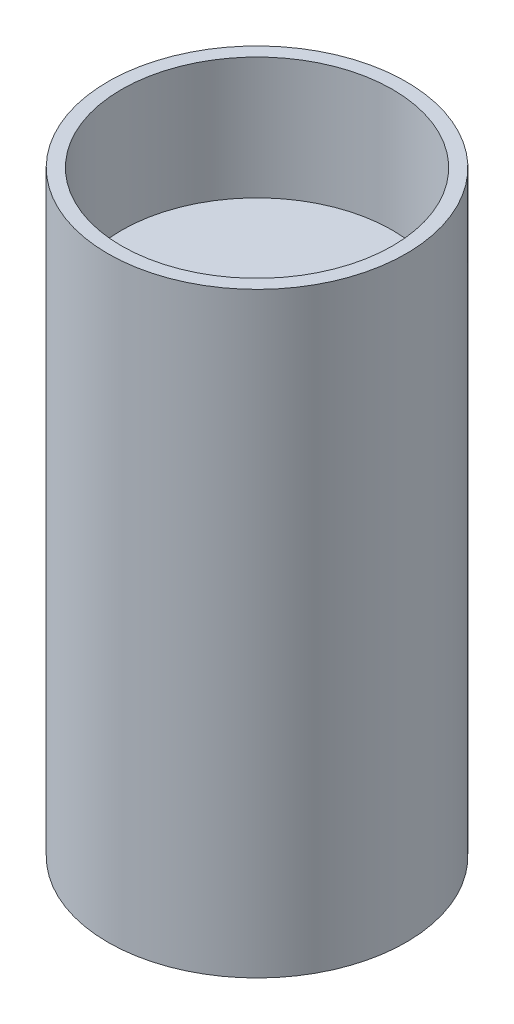
ISO-10303-21;
HEADER;
FILE_DESCRIPTION(('STEP AP214'),'2;1');
FILE_NAME('part.step','',(''),(''),'','','');
FILE_SCHEMA(('AUTOMOTIVE_DESIGN { 1 0 10303 214 1 1 1 1 }'));
ENDSEC;
DATA;
#1=APPLICATION_CONTEXT('core data for automotive mechanical design processes');
#2=APPLICATION_PROTOCOL_DEFINITION('international standard','automotive_design',2000,#1);
#3=PRODUCT_CONTEXT('',#1,'mechanical');
#4=PRODUCT('Part','Part','',(#3));
#5=PRODUCT_RELATED_PRODUCT_CATEGORY('part','',(#4));
#6=PRODUCT_DEFINITION_FORMATION('','',#4);
#7=PRODUCT_DEFINITION_CONTEXT('part definition',#1,'design');
#8=PRODUCT_DEFINITION('design','',#6,#7);
#9=PRODUCT_DEFINITION_SHAPE('','',#8);
#10=(LENGTH_UNIT() NAMED_UNIT(*) SI_UNIT(.MILLI.,.METRE.));
#11=(NAMED_UNIT(*) PLANE_ANGLE_UNIT() SI_UNIT($,.RADIAN.));
#12=(NAMED_UNIT(*) SI_UNIT($,.STERADIAN.) SOLID_ANGLE_UNIT());
#13=UNCERTAINTY_MEASURE_WITH_UNIT(LENGTH_MEASURE(1.E-05),#10,'distance_accuracy_value','');
#14=(GEOMETRIC_REPRESENTATION_CONTEXT(3) GLOBAL_UNCERTAINTY_ASSIGNED_CONTEXT((#13)) GLOBAL_UNIT_ASSIGNED_CONTEXT((#10,
#11,#12)) REPRESENTATION_CONTEXT('',''));
#15=CARTESIAN_POINT('',(0.,0.,0.));
#16=DIRECTION('',(0.,0.,1.));
#17=DIRECTION('',(1.,0.,0.));
#18=AXIS2_PLACEMENT_3D('',#15,#16,#17);
#19=CARTESIAN_POINT('',(0.,220.,0.));
#20=DIRECTION('',(0.,-1.,0.));
#21=DIRECTION('',(0.,0.,-1.));
#22=AXIS2_PLACEMENT_3D('',#19,#20,#21);
#23=CYLINDRICAL_SURFACE('',#22,55.);
#24=CARTESIAN_POINT('',(0.,220.,0.));
#25=DIRECTION('',(0.,1.,0.));
#26=DIRECTION('',(0.,0.,1.));
#27=AXIS2_PLACEMENT_3D('',#24,#25,#26);
#28=CIRCLE('',#27,55.);
#29=CARTESIAN_POINT('',(0.,220.,55.));
#30=VERTEX_POINT('',#29);
#31=EDGE_CURVE('E10',#30,#30,#28,.T.);
#32=ORIENTED_EDGE('',*,*,#31,.F.);
#33=EDGE_LOOP('',(#32));
#34=FACE_BOUND('',#33,.T.);
#35=CARTESIAN_POINT('',(0.,0.,0.));
#36=DIRECTION('',(0.,1.,0.));
#37=DIRECTION('',(0.,0.,1.));
#38=AXIS2_PLACEMENT_3D('',#35,#36,#37);
#39=CIRCLE('',#38,55.);
#40=CARTESIAN_POINT('',(0.,0.,55.));
#41=VERTEX_POINT('',#40);
#42=EDGE_CURVE('E40',#41,#41,#39,.T.);
#43=ORIENTED_EDGE('',*,*,#42,.T.);
#44=EDGE_LOOP('',(#43));
#45=FACE_BOUND('',#44,.T.);
#46=ADVANCED_FACE('F37',(#34,#45),#23,.T.);
#47=CARTESIAN_POINT('',(0.,220.,0.));
#48=DIRECTION('',(0.,1.,0.));
#49=DIRECTION('',(0.,0.,1.));
#50=AXIS2_PLACEMENT_3D('',#47,#48,#49);
#51=PLANE('',#50);
#52=CARTESIAN_POINT('',(0.,220.,0.));
#53=DIRECTION('',(0.,1.,0.));
#54=DIRECTION('',(0.,0.,1.));
#55=AXIS2_PLACEMENT_3D('',#52,#53,#54);
#56=CIRCLE('',#55,50.);
#57=CARTESIAN_POINT('',(0.,220.,50.));
#58=VERTEX_POINT('',#57);
#59=EDGE_CURVE('E59',#58,#58,#56,.T.);
#60=ORIENTED_EDGE('',*,*,#59,.F.);
#61=EDGE_LOOP('',(#60));
#62=FACE_BOUND('',#61,.T.);
#63=ORIENTED_EDGE('',*,*,#31,.T.);
#64=EDGE_LOOP('',(#63));
#65=FACE_BOUND('',#64,.T.);
#66=ADVANCED_FACE('F76',(#62,#65),#51,.T.);
#67=CARTESIAN_POINT('',(0.,0.,0.));
#68=DIRECTION('',(0.,1.,0.));
#69=DIRECTION('',(0.,0.,1.));
#70=AXIS2_PLACEMENT_3D('',#67,#68,#69);
#71=PLANE('',#70);
#72=CARTESIAN_POINT('',(0.,0.,0.));
#73=DIRECTION('',(0.,-1.,0.));
#74=DIRECTION('',(0.,0.,-1.));
#75=AXIS2_PLACEMENT_3D('',#72,#73,#74);
#76=CIRCLE('',#75,46.9865799165357);
#77=CARTESIAN_POINT('',(0.,0.,-46.9865799165357));
#78=VERTEX_POINT('',#77);
#79=EDGE_CURVE('E51',#78,#78,#76,.T.);
#80=ORIENTED_EDGE('',*,*,#79,.F.);
#81=EDGE_LOOP('',(#80));
#82=FACE_BOUND('',#81,.T.);
#83=ORIENTED_EDGE('',*,*,#42,.F.);
#84=EDGE_LOOP('',(#83));
#85=FACE_BOUND('',#84,.T.);
#86=ADVANCED_FACE('F78',(#82,#85),#71,.F.);
#87=CARTESIAN_POINT('',(0.,150.,0.));
#88=DIRECTION('',(0.,-1.,0.));
#89=DIRECTION('',(0.,0.,-1.));
#90=AXIS2_PLACEMENT_3D('',#87,#88,#89);
#91=CYLINDRICAL_SURFACE('',#90,46.9865799165357);
#92=CARTESIAN_POINT('',(0.,150.,0.));
#93=DIRECTION('',(0.,-1.,0.));
#94=DIRECTION('',(0.,0.,-1.));
#95=AXIS2_PLACEMENT_3D('',#92,#93,#94);
#96=CIRCLE('',#95,46.9865799165357);
#97=CARTESIAN_POINT('',(0.,150.,-46.9865799165357));
#98=VERTEX_POINT('',#97);
#99=EDGE_CURVE('E49',#98,#98,#96,.T.);
#100=ORIENTED_EDGE('',*,*,#99,.F.);
#101=EDGE_LOOP('',(#100));
#102=FACE_BOUND('',#101,.T.);
#103=ORIENTED_EDGE('',*,*,#79,.T.);
#104=EDGE_LOOP('',(#103));
#105=FACE_BOUND('',#104,.T.);
#106=ADVANCED_FACE('F84',(#102,#105),#91,.F.);
#107=CARTESIAN_POINT('',(0.,150.,0.));
#108=DIRECTION('',(0.,-1.,0.));
#109=DIRECTION('',(0.,0.,-1.));
#110=AXIS2_PLACEMENT_3D('',#107,#108,#109);
#111=PLANE('',#110);
#112=ORIENTED_EDGE('',*,*,#99,.T.);
#113=EDGE_LOOP('',(#112));
#114=FACE_BOUND('',#113,.T.);
#115=ADVANCED_FACE('F72',(#114),#111,.T.);
#116=CARTESIAN_POINT('',(0.,175.,0.));
#117=DIRECTION('',(0.,1.,0.));
#118=DIRECTION('',(0.,0.,1.));
#119=AXIS2_PLACEMENT_3D('',#116,#117,#118);
#120=CYLINDRICAL_SURFACE('',#119,50.);
#121=CARTESIAN_POINT('',(0.,175.,0.));
#122=DIRECTION('',(0.,1.,0.));
#123=DIRECTION('',(0.,0.,1.));
#124=AXIS2_PLACEMENT_3D('',#121,#122,#123);
#125=CIRCLE('',#124,50.);
#126=CARTESIAN_POINT('',(0.,175.,50.));
#127=VERTEX_POINT('',#126);
#128=EDGE_CURVE('E55',#127,#127,#125,.T.);
#129=CARTESIAN_POINT('',(0.,175.,50.));
#130=CARTESIAN_POINT('',(0.,175.46875,50.));
#131=CARTESIAN_POINT('',(0.,175.9375,50.));
#132=CARTESIAN_POINT('',(0.,176.875,50.));
#133=CARTESIAN_POINT('',(0.,177.34375,50.));
#134=CARTESIAN_POINT('',(0.,178.28125,50.));
#135=CARTESIAN_POINT('',(0.,178.75,50.));
#136=CARTESIAN_POINT('',(0.,179.6875,50.));
#137=CARTESIAN_POINT('',(0.,180.15625,50.));
#138=CARTESIAN_POINT('',(0.,181.09375,50.));
#139=CARTESIAN_POINT('',(0.,181.5625,50.));
#140=CARTESIAN_POINT('',(0.,182.5,50.));
#141=CARTESIAN_POINT('',(0.,182.96875,50.));
#142=CARTESIAN_POINT('',(0.,183.90625,50.));
#143=CARTESIAN_POINT('',(0.,184.375,50.));
#144=CARTESIAN_POINT('',(0.,185.3125,50.));
#145=CARTESIAN_POINT('',(0.,185.78125,50.));
#146=CARTESIAN_POINT('',(0.,186.71875,50.));
#147=CARTESIAN_POINT('',(0.,187.1875,50.));
#148=CARTESIAN_POINT('',(0.,188.125,50.));
#149=CARTESIAN_POINT('',(0.,188.59375,50.));
#150=CARTESIAN_POINT('',(0.,189.53125,50.));
#151=CARTESIAN_POINT('',(0.,190.,50.));
#152=CARTESIAN_POINT('',(0.,190.9375,50.));
#153=CARTESIAN_POINT('',(0.,191.40625,50.));
#154=CARTESIAN_POINT('',(0.,192.34375,50.));
#155=CARTESIAN_POINT('',(0.,192.8125,50.));
#156=CARTESIAN_POINT('',(0.,193.75,50.));
#157=CARTESIAN_POINT('',(0.,194.21875,50.));
#158=CARTESIAN_POINT('',(0.,195.15625,50.));
#159=CARTESIAN_POINT('',(0.,195.625,50.));
#160=CARTESIAN_POINT('',(0.,196.5625,50.));
#161=CARTESIAN_POINT('',(0.,197.03125,50.));
#162=CARTESIAN_POINT('',(0.,197.96875,50.));
#163=CARTESIAN_POINT('',(0.,198.4375,50.));
#164=CARTESIAN_POINT('',(0.,199.375,50.));
#165=CARTESIAN_POINT('',(0.,199.84375,50.));
#166=CARTESIAN_POINT('',(0.,200.78125,50.));
#167=CARTESIAN_POINT('',(0.,201.25,50.));
#168=CARTESIAN_POINT('',(0.,202.1875,50.));
#169=CARTESIAN_POINT('',(0.,202.65625,50.));
#170=CARTESIAN_POINT('',(0.,203.59375,50.));
#171=CARTESIAN_POINT('',(0.,204.0625,50.));
#172=CARTESIAN_POINT('',(0.,205.,50.));
#173=CARTESIAN_POINT('',(0.,205.46875,50.));
#174=CARTESIAN_POINT('',(0.,206.40625,50.));
#175=CARTESIAN_POINT('',(0.,206.875,50.));
#176=CARTESIAN_POINT('',(0.,207.8125,50.));
#177=CARTESIAN_POINT('',(0.,208.28125,50.));
#178=CARTESIAN_POINT('',(0.,209.21875,50.));
#179=CARTESIAN_POINT('',(0.,209.6875,50.));
#180=CARTESIAN_POINT('',(0.,210.625,50.));
#181=CARTESIAN_POINT('',(0.,211.09375,50.));
#182=CARTESIAN_POINT('',(0.,212.03125,50.));
#183=CARTESIAN_POINT('',(0.,212.5,50.));
#184=CARTESIAN_POINT('',(0.,213.4375,50.));
#185=CARTESIAN_POINT('',(0.,213.90625,50.));
#186=CARTESIAN_POINT('',(0.,214.84375,50.));
#187=CARTESIAN_POINT('',(0.,215.3125,50.));
#188=CARTESIAN_POINT('',(0.,216.25,50.));
#189=CARTESIAN_POINT('',(0.,216.71875,50.));
#190=CARTESIAN_POINT('',(0.,217.65625,50.));
#191=CARTESIAN_POINT('',(0.,218.125,50.));
#192=CARTESIAN_POINT('',(0.,219.0625,50.));
#193=CARTESIAN_POINT('',(0.,219.53125,50.));
#194=CARTESIAN_POINT('',(0.,220.,50.));
#195=B_SPLINE_CURVE_WITH_KNOTS('',3,(#129,#130,#131,#132,#133,#134,#135,#136,#137,#138,#139,
#140,#141,#142,#143,#144,#145,#146,#147,#148,#149,#150,#151,#152,#153,#154,#155,#156,#157,#158,
#159,#160,#161,#162,#163,#164,#165,#166,#167,#168,#169,#170,#171,#172,#173,#174,#175,#176,#177,
#178,#179,#180,#181,#182,#183,#184,#185,#186,#187,#188,#189,#190,#191,#192,#193,#194),
.UNSPECIFIED.,.F.,.F.,(4,2,2,2,2,2,2,2,2,2,2,2,2,2,2,2,2,2,2,2,2,2,2,2,2,2,2,2,2,2,2,2,4),(0.,
1.40625000000003,2.81250000000002,4.21875000000002,5.62500000000002,7.03125000000002,
8.43750000000001,9.84375000000001,11.25,12.65625,14.0625,15.46875,16.875,18.28125,19.6875,
21.09375,22.5,23.90625,25.3125,26.71875,28.125,29.53125,30.9375,32.34375,33.75,35.15625,36.5625,
37.96875,39.375,40.78125,42.1875,43.59375,45.),.UNSPECIFIED.);
#196=EDGE_CURVE('BSEAM69',#127,#58,#195,.T.);
#197=ORIENTED_EDGE('',*,*,#128,.F.);
#198=ORIENTED_EDGE('',*,*,#59,.T.);
#199=ORIENTED_EDGE('',*,*,#196,.T.);
#200=ORIENTED_EDGE('',*,*,#196,.F.);
#201=EDGE_LOOP('',(#197,#199,#198,#200));
#202=FACE_BOUND('',#201,.T.);
#203=ADVANCED_FACE('F69',(#202),#120,.F.);
#204=CARTESIAN_POINT('',(0.,175.,0.));
#205=DIRECTION('',(0.,1.,0.));
#206=DIRECTION('',(0.,0.,1.));
#207=AXIS2_PLACEMENT_3D('',#204,#205,#206);
#208=PLANE('',#207);
#209=ORIENTED_EDGE('',*,*,#128,.T.);
#210=EDGE_LOOP('',(#209));
#211=FACE_BOUND('',#210,.T.);
#212=ADVANCED_FACE('F67',(#211),#208,.T.);
#213=CLOSED_SHELL('',(#46,#66,#86,#106,#115,#203,#212));
#214=MANIFOLD_SOLID_BREP('B2',#213);
#215=ADVANCED_BREP_SHAPE_REPRESENTATION('',(#18,#214),#14);
#216=SHAPE_DEFINITION_REPRESENTATION(#9,#215);
ENDSEC;
END-ISO-10303-21;
